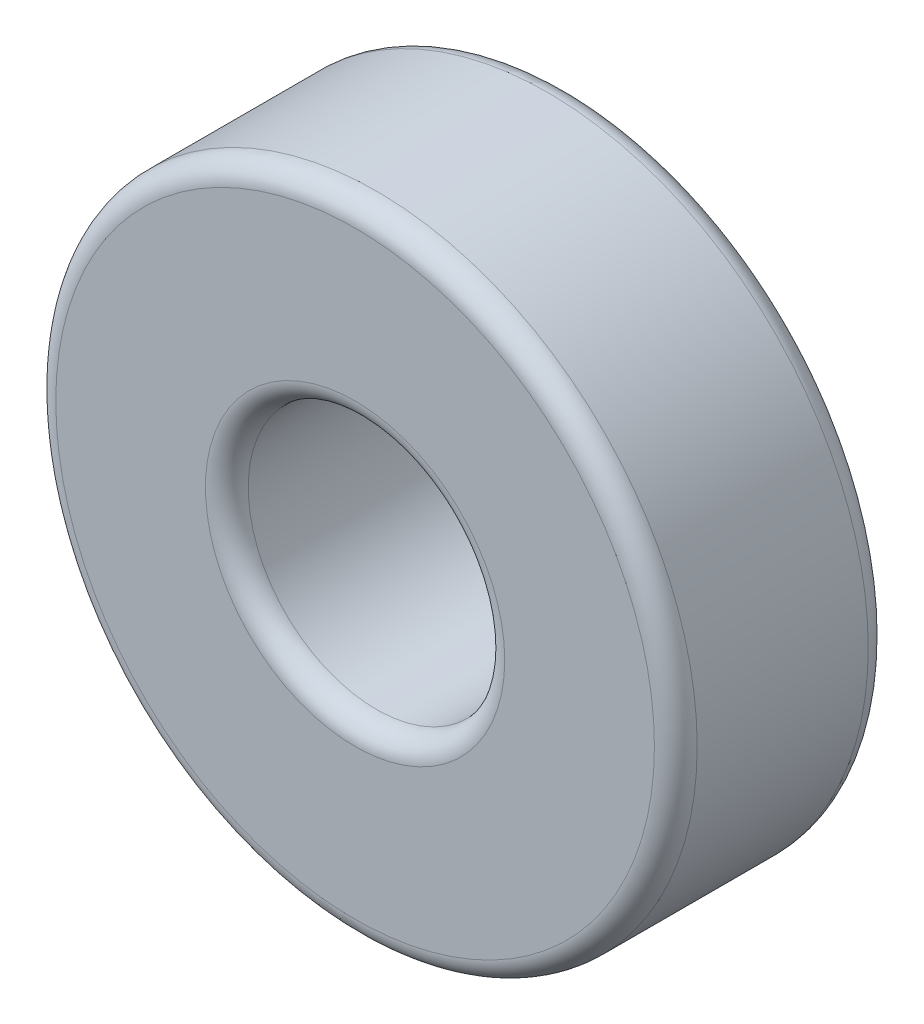
ISO-10303-21;
HEADER;
FILE_DESCRIPTION(('STEP AP214'),'2;1');
FILE_NAME('part.step','',(''),(''),'','','');
FILE_SCHEMA(('AUTOMOTIVE_DESIGN { 1 0 10303 214 1 1 1 1 }'));
ENDSEC;
DATA;
#1=APPLICATION_CONTEXT('core data for automotive mechanical design processes');
#2=APPLICATION_PROTOCOL_DEFINITION('international standard','automotive_design',2000,#1);
#3=PRODUCT_CONTEXT('',#1,'mechanical');
#4=PRODUCT('Part','Part','',(#3));
#5=PRODUCT_RELATED_PRODUCT_CATEGORY('part','',(#4));
#6=PRODUCT_DEFINITION_FORMATION('','',#4);
#7=PRODUCT_DEFINITION_CONTEXT('part definition',#1,'design');
#8=PRODUCT_DEFINITION('design','',#6,#7);
#9=PRODUCT_DEFINITION_SHAPE('','',#8);
#10=(LENGTH_UNIT() NAMED_UNIT(*) SI_UNIT(.MILLI.,.METRE.));
#11=(NAMED_UNIT(*) PLANE_ANGLE_UNIT() SI_UNIT($,.RADIAN.));
#12=(NAMED_UNIT(*) SI_UNIT($,.STERADIAN.) SOLID_ANGLE_UNIT());
#13=UNCERTAINTY_MEASURE_WITH_UNIT(LENGTH_MEASURE(1.E-05),#10,'distance_accuracy_value','');
#14=(GEOMETRIC_REPRESENTATION_CONTEXT(3) GLOBAL_UNCERTAINTY_ASSIGNED_CONTEXT((#13)) GLOBAL_UNIT_ASSIGNED_CONTEXT((#10,
#11,#12)) REPRESENTATION_CONTEXT('',''));
#15=CARTESIAN_POINT('',(0.,0.,0.));
#16=DIRECTION('',(0.,0.,1.));
#17=DIRECTION('',(1.,0.,0.));
#18=AXIS2_PLACEMENT_3D('',#15,#16,#17);
#19=CARTESIAN_POINT('',(0.,0.,5.));
#20=DIRECTION('',(0.,0.,1.));
#21=DIRECTION('',(1.,0.,0.));
#22=AXIS2_PLACEMENT_3D('',#19,#20,#21);
#23=PLANE('',#22);
#24=CARTESIAN_POINT('',(0.,0.,5.));
#25=DIRECTION('',(0.,0.,1.));
#26=DIRECTION('',(1.,0.,0.));
#27=AXIS2_PLACEMENT_3D('',#24,#25,#26);
#28=CIRCLE('',#27,3.5);
#29=CARTESIAN_POINT('',(3.5,0.,5.));
#30=VERTEX_POINT('',#29);
#31=EDGE_CURVE('E10',#30,#30,#28,.F.);
#32=ORIENTED_EDGE('',*,*,#31,.T.);
#33=EDGE_LOOP('',(#32));
#34=FACE_BOUND('',#33,.T.);
#35=CARTESIAN_POINT('',(0.,0.,5.));
#36=DIRECTION('',(0.,0.,1.));
#37=DIRECTION('',(1.,0.,0.));
#38=AXIS2_PLACEMENT_3D('',#35,#36,#37);
#39=CIRCLE('',#38,7.);
#40=CARTESIAN_POINT('',(7.,0.,5.));
#41=VERTEX_POINT('',#40);
#42=EDGE_CURVE('E40',#41,#41,#39,.T.);
#43=ORIENTED_EDGE('',*,*,#42,.T.);
#44=EDGE_LOOP('',(#43));
#45=FACE_BOUND('',#44,.T.);
#46=ADVANCED_FACE('F33',(#34,#45),#23,.T.);
#47=CARTESIAN_POINT('',(0.,0.,0.));
#48=DIRECTION('',(0.,0.,1.));
#49=DIRECTION('',(1.,0.,0.));
#50=AXIS2_PLACEMENT_3D('',#47,#48,#49);
#51=PLANE('',#50);
#52=CARTESIAN_POINT('',(0.,0.,0.));
#53=DIRECTION('',(0.,0.,1.));
#54=DIRECTION('',(1.,0.,0.));
#55=AXIS2_PLACEMENT_3D('',#52,#53,#54);
#56=CIRCLE('',#55,3.5);
#57=CARTESIAN_POINT('',(3.5,0.,0.));
#58=VERTEX_POINT('',#57);
#59=EDGE_CURVE('E59',#58,#58,#56,.T.);
#60=ORIENTED_EDGE('',*,*,#59,.T.);
#61=EDGE_LOOP('',(#60));
#62=FACE_BOUND('',#61,.T.);
#63=CARTESIAN_POINT('',(0.,0.,0.));
#64=DIRECTION('',(0.,0.,1.));
#65=DIRECTION('',(1.,0.,0.));
#66=AXIS2_PLACEMENT_3D('',#63,#64,#65);
#67=CIRCLE('',#66,7.);
#68=CARTESIAN_POINT('',(7.,0.,0.));
#69=VERTEX_POINT('',#68);
#70=EDGE_CURVE('E62',#69,#69,#67,.F.);
#71=ORIENTED_EDGE('',*,*,#70,.T.);
#72=EDGE_LOOP('',(#71));
#73=FACE_BOUND('',#72,.T.);
#74=ADVANCED_FACE('F66',(#62,#73),#51,.F.);
#75=CARTESIAN_POINT('',(0.,0.,5.));
#76=DIRECTION('',(0.,0.,-1.));
#77=DIRECTION('',(-1.,0.,0.));
#78=AXIS2_PLACEMENT_3D('',#75,#76,#77);
#79=CYLINDRICAL_SURFACE('',#78,7.5);
#80=CARTESIAN_POINT('',(0.,0.,0.5));
#81=DIRECTION('',(0.,0.,1.));
#82=DIRECTION('',(1.,0.,0.));
#83=AXIS2_PLACEMENT_3D('',#80,#81,#82);
#84=CIRCLE('',#83,7.5);
#85=CARTESIAN_POINT('',(7.5,0.,0.5));
#86=VERTEX_POINT('',#85);
#87=EDGE_CURVE('E44',#86,#86,#84,.T.);
#88=ORIENTED_EDGE('',*,*,#87,.T.);
#89=EDGE_LOOP('',(#88));
#90=FACE_BOUND('',#89,.T.);
#91=CARTESIAN_POINT('',(0.,0.,4.5));
#92=DIRECTION('',(0.,0.,1.));
#93=DIRECTION('',(1.,0.,0.));
#94=AXIS2_PLACEMENT_3D('',#91,#92,#93);
#95=CIRCLE('',#94,7.5);
#96=CARTESIAN_POINT('',(7.5,0.,4.5));
#97=VERTEX_POINT('',#96);
#98=EDGE_CURVE('E48',#97,#97,#95,.F.);
#99=ORIENTED_EDGE('',*,*,#98,.T.);
#100=EDGE_LOOP('',(#99));
#101=FACE_BOUND('',#100,.T.);
#102=ADVANCED_FACE('F76',(#90,#101),#79,.T.);
#103=CARTESIAN_POINT('',(0.,0.,5.));
#104=DIRECTION('',(0.,0.,-1.));
#105=DIRECTION('',(-1.,0.,0.));
#106=AXIS2_PLACEMENT_3D('',#103,#104,#105);
#107=CYLINDRICAL_SURFACE('',#106,3.);
#108=CARTESIAN_POINT('',(0.,0.,0.5));
#109=DIRECTION('',(0.,0.,1.));
#110=DIRECTION('',(1.,0.,0.));
#111=AXIS2_PLACEMENT_3D('',#108,#109,#110);
#112=CIRCLE('',#111,3.);
#113=CARTESIAN_POINT('',(3.,0.,0.5));
#114=VERTEX_POINT('',#113);
#115=EDGE_CURVE('E53',#114,#114,#112,.F.);
#116=ORIENTED_EDGE('',*,*,#115,.T.);
#117=EDGE_LOOP('',(#116));
#118=FACE_BOUND('',#117,.T.);
#119=CARTESIAN_POINT('',(0.,0.,4.5));
#120=DIRECTION('',(0.,0.,1.));
#121=DIRECTION('',(1.,0.,0.));
#122=AXIS2_PLACEMENT_3D('',#119,#120,#121);
#123=CIRCLE('',#122,3.);
#124=CARTESIAN_POINT('',(3.,0.,4.5));
#125=VERTEX_POINT('',#124);
#126=EDGE_CURVE('E56',#125,#125,#123,.T.);
#127=ORIENTED_EDGE('',*,*,#126,.T.);
#128=EDGE_LOOP('',(#127));
#129=FACE_BOUND('',#128,.T.);
#130=ADVANCED_FACE('F79',(#118,#129),#107,.F.);
#131=CARTESIAN_POINT('',(0.,0.,0.5));
#132=DIRECTION('',(0.,0.,1.));
#133=DIRECTION('',(1.,0.,0.));
#134=AXIS2_PLACEMENT_3D('',#131,#132,#133);
#135=TOROIDAL_SURFACE('',#134,3.5,0.5);
#136=ORIENTED_EDGE('',*,*,#115,.F.);
#137=EDGE_LOOP('',(#136));
#138=FACE_BOUND('',#137,.T.);
#139=ORIENTED_EDGE('',*,*,#59,.F.);
#140=EDGE_LOOP('',(#139));
#141=FACE_BOUND('',#140,.T.);
#142=ADVANCED_FACE('F72',(#138,#141),#135,.T.);
#143=CARTESIAN_POINT('',(0.,0.,0.5));
#144=DIRECTION('',(0.,0.,1.));
#145=DIRECTION('',(1.,0.,0.));
#146=AXIS2_PLACEMENT_3D('',#143,#144,#145);
#147=TOROIDAL_SURFACE('',#146,7.,0.5);
#148=ORIENTED_EDGE('',*,*,#70,.F.);
#149=EDGE_LOOP('',(#148));
#150=FACE_BOUND('',#149,.T.);
#151=ORIENTED_EDGE('',*,*,#87,.F.);
#152=EDGE_LOOP('',(#151));
#153=FACE_BOUND('',#152,.T.);
#154=ADVANCED_FACE('F68',(#150,#153),#147,.T.);
#155=CARTESIAN_POINT('',(0.,0.,4.5));
#156=DIRECTION('',(0.,0.,1.));
#157=DIRECTION('',(1.,0.,0.));
#158=AXIS2_PLACEMENT_3D('',#155,#156,#157);
#159=TOROIDAL_SURFACE('',#158,3.5,0.5);
#160=ORIENTED_EDGE('',*,*,#31,.F.);
#161=EDGE_LOOP('',(#160));
#162=FACE_BOUND('',#161,.T.);
#163=ORIENTED_EDGE('',*,*,#126,.F.);
#164=EDGE_LOOP('',(#163));
#165=FACE_BOUND('',#164,.T.);
#166=ADVANCED_FACE('F71',(#162,#165),#159,.T.);
#167=CARTESIAN_POINT('',(0.,0.,4.5));
#168=DIRECTION('',(0.,0.,1.));
#169=DIRECTION('',(1.,0.,0.));
#170=AXIS2_PLACEMENT_3D('',#167,#168,#169);
#171=TOROIDAL_SURFACE('',#170,7.,0.5);
#172=ORIENTED_EDGE('',*,*,#98,.F.);
#173=EDGE_LOOP('',(#172));
#174=FACE_BOUND('',#173,.T.);
#175=ORIENTED_EDGE('',*,*,#42,.F.);
#176=EDGE_LOOP('',(#175));
#177=FACE_BOUND('',#176,.T.);
#178=ADVANCED_FACE('F35',(#174,#177),#171,.T.);
#179=CLOSED_SHELL('',(#46,#74,#102,#130,#142,#154,#166,#178));
#180=MANIFOLD_SOLID_BREP('B2',#179);
#181=ADVANCED_BREP_SHAPE_REPRESENTATION('',(#18,#180),#14);
#182=SHAPE_DEFINITION_REPRESENTATION(#9,#181);
ENDSEC;
END-ISO-10303-21;
